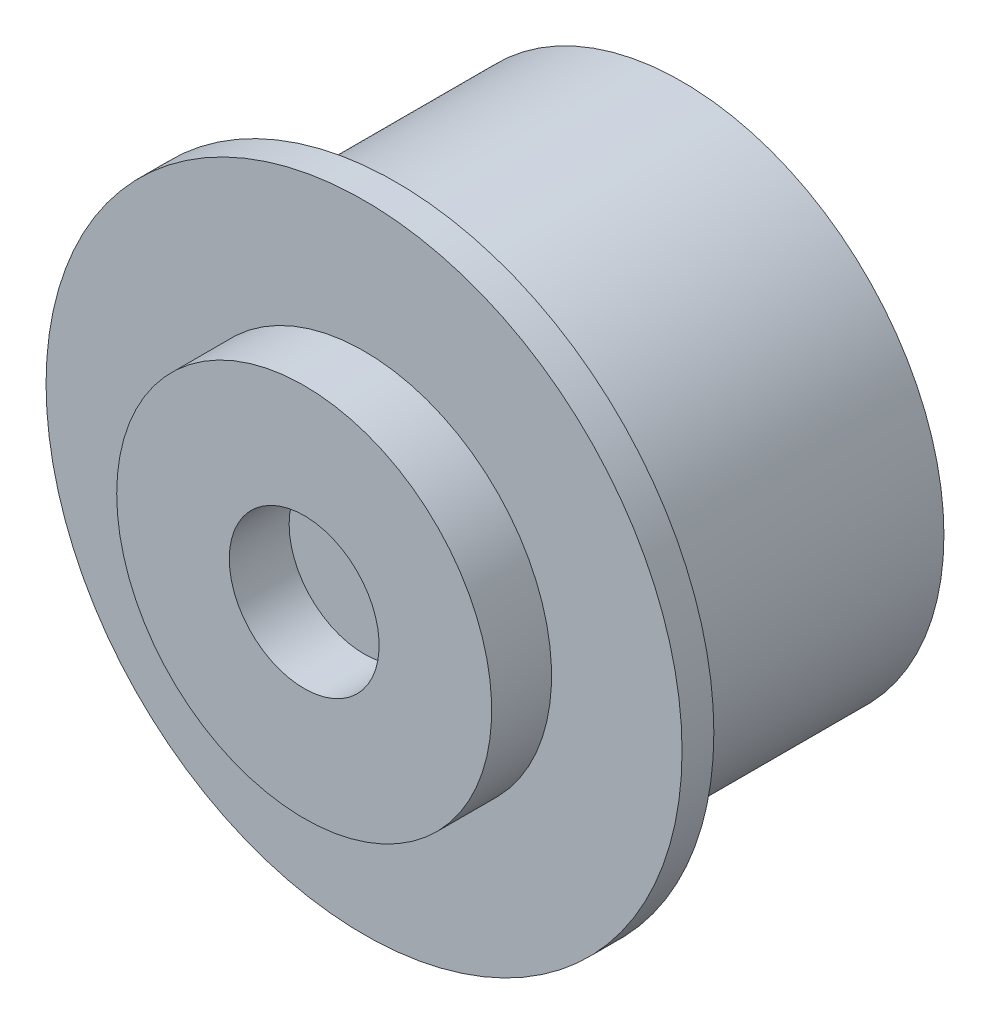
ISO-10303-21;
HEADER;
FILE_DESCRIPTION(('STEP AP214'),'2;1');
FILE_NAME('part.step','',(''),(''),'','','');
FILE_SCHEMA(('AUTOMOTIVE_DESIGN { 1 0 10303 214 1 1 1 1 }'));
ENDSEC;
DATA;
#1=APPLICATION_CONTEXT('core data for automotive mechanical design processes');
#2=APPLICATION_PROTOCOL_DEFINITION('international standard','automotive_design',2000,#1);
#3=PRODUCT_CONTEXT('',#1,'mechanical');
#4=PRODUCT('Part','Part','',(#3));
#5=PRODUCT_RELATED_PRODUCT_CATEGORY('part','',(#4));
#6=PRODUCT_DEFINITION_FORMATION('','',#4);
#7=PRODUCT_DEFINITION_CONTEXT('part definition',#1,'design');
#8=PRODUCT_DEFINITION('design','',#6,#7);
#9=PRODUCT_DEFINITION_SHAPE('','',#8);
#10=(LENGTH_UNIT() NAMED_UNIT(*) SI_UNIT(.MILLI.,.METRE.));
#11=(NAMED_UNIT(*) PLANE_ANGLE_UNIT() SI_UNIT($,.RADIAN.));
#12=(NAMED_UNIT(*) SI_UNIT($,.STERADIAN.) SOLID_ANGLE_UNIT());
#13=UNCERTAINTY_MEASURE_WITH_UNIT(LENGTH_MEASURE(1.E-05),#10,'distance_accuracy_value','');
#14=(GEOMETRIC_REPRESENTATION_CONTEXT(3) GLOBAL_UNCERTAINTY_ASSIGNED_CONTEXT((#13)) GLOBAL_UNIT_ASSIGNED_CONTEXT((#10,
#11,#12)) REPRESENTATION_CONTEXT('',''));
#15=CARTESIAN_POINT('',(0.,0.,0.));
#16=DIRECTION('',(0.,0.,1.));
#17=DIRECTION('',(1.,0.,0.));
#18=AXIS2_PLACEMENT_3D('',#15,#16,#17);
#19=CARTESIAN_POINT('',(0.,0.,0.));
#20=DIRECTION('',(0.,0.,-1.));
#21=DIRECTION('',(-1.,0.,0.));
#22=AXIS2_PLACEMENT_3D('',#19,#20,#21);
#23=PLANE('',#22);
#24=CARTESIAN_POINT('',(0.,0.,0.));
#25=DIRECTION('',(0.,0.,-1.));
#26=DIRECTION('',(-1.,0.,0.));
#27=AXIS2_PLACEMENT_3D('',#24,#25,#26);
#28=CIRCLE('',#27,2.003);
#29=CARTESIAN_POINT('',(-2.003,0.,0.));
#30=VERTEX_POINT('',#29);
#31=EDGE_CURVE('E40',#30,#30,#28,.F.);
#32=ORIENTED_EDGE('',*,*,#31,.T.);
#33=EDGE_LOOP('',(#32));
#34=FACE_BOUND('',#33,.T.);
#35=ADVANCED_FACE('F37',(#34),#23,.F.);
#36=CARTESIAN_POINT('',(0.,0.,2.105));
#37=DIRECTION('',(0.,0.,-1.));
#38=DIRECTION('',(-1.,0.,0.));
#39=AXIS2_PLACEMENT_3D('',#36,#37,#38);
#40=CYLINDRICAL_SURFACE('',#39,2.003);
#41=CARTESIAN_POINT('',(0.,0.,1.6));
#42=DIRECTION('',(0.,0.,-1.));
#43=DIRECTION('',(-1.,0.,0.));
#44=AXIS2_PLACEMENT_3D('',#41,#42,#43);
#45=CIRCLE('',#44,2.003);
#46=CARTESIAN_POINT('',(-2.003,0.,1.6));
#47=VERTEX_POINT('',#46);
#48=EDGE_CURVE('E80',#47,#47,#45,.F.);
#49=ORIENTED_EDGE('',*,*,#48,.T.);
#50=EDGE_LOOP('',(#49));
#51=FACE_BOUND('',#50,.T.);
#52=ORIENTED_EDGE('',*,*,#31,.F.);
#53=EDGE_LOOP('',(#52));
#54=FACE_BOUND('',#53,.T.);
#55=ADVANCED_FACE('F93',(#51,#54),#40,.F.);
#56=CARTESIAN_POINT('',(0.,0.,1.6));
#57=DIRECTION('',(0.,0.,-1.));
#58=DIRECTION('',(-1.,0.,0.));
#59=AXIS2_PLACEMENT_3D('',#56,#57,#58);
#60=PLANE('',#59);
#61=ORIENTED_EDGE('',*,*,#48,.F.);
#62=EDGE_LOOP('',(#61));
#63=FACE_BOUND('',#62,.T.);
#64=CARTESIAN_POINT('',(0.,0.,1.6));
#65=DIRECTION('',(0.,0.,-1.));
#66=DIRECTION('',(-1.,0.,0.));
#67=AXIS2_PLACEMENT_3D('',#64,#65,#66);
#68=CIRCLE('',#67,5.01175);
#69=CARTESIAN_POINT('',(-5.01175,0.,1.6));
#70=VERTEX_POINT('',#69);
#71=EDGE_CURVE('E76',#70,#70,#68,.T.);
#72=ORIENTED_EDGE('',*,*,#71,.F.);
#73=EDGE_LOOP('',(#72));
#74=FACE_BOUND('',#73,.T.);
#75=ADVANCED_FACE('F95',(#63,#74),#60,.F.);
#76=CARTESIAN_POINT('',(0.,0.,2.105));
#77=DIRECTION('',(0.,0.,-1.));
#78=DIRECTION('',(-1.,0.,0.));
#79=AXIS2_PLACEMENT_3D('',#76,#77,#78);
#80=CYLINDRICAL_SURFACE('',#79,5.01175);
#81=ORIENTED_EDGE('',*,*,#71,.T.);
#82=EDGE_LOOP('',(#81));
#83=FACE_BOUND('',#82,.T.);
#84=CARTESIAN_POINT('',(0.,0.,0.));
#85=DIRECTION('',(0.,0.,-1.));
#86=DIRECTION('',(-1.,0.,0.));
#87=AXIS2_PLACEMENT_3D('',#84,#85,#86);
#88=CIRCLE('',#87,5.01175);
#89=CARTESIAN_POINT('',(-5.01175,0.,0.));
#90=VERTEX_POINT('',#89);
#91=EDGE_CURVE('E72',#90,#90,#88,.F.);
#92=ORIENTED_EDGE('',*,*,#91,.T.);
#93=EDGE_LOOP('',(#92));
#94=FACE_BOUND('',#93,.T.);
#95=ADVANCED_FACE('F100',(#83,#94),#80,.T.);
#96=CARTESIAN_POINT('',(0.,0.,0.));
#97=DIRECTION('',(0.,0.,-1.));
#98=DIRECTION('',(-1.,0.,0.));
#99=AXIS2_PLACEMENT_3D('',#96,#97,#98);
#100=PLANE('',#99);
#101=ORIENTED_EDGE('',*,*,#91,.F.);
#102=EDGE_LOOP('',(#101));
#103=FACE_BOUND('',#102,.T.);
#104=CARTESIAN_POINT('',(0.,0.,0.));
#105=DIRECTION('',(0.,0.,-1.));
#106=DIRECTION('',(-1.,0.,0.));
#107=AXIS2_PLACEMENT_3D('',#104,#105,#106);
#108=CIRCLE('',#107,8.5);
#109=CARTESIAN_POINT('',(-8.5,0.,0.));
#110=VERTEX_POINT('',#109);
#111=EDGE_CURVE('E66',#110,#110,#108,.T.);
#112=ORIENTED_EDGE('',*,*,#111,.F.);
#113=EDGE_LOOP('',(#112));
#114=FACE_BOUND('',#113,.T.);
#115=ADVANCED_FACE('F129',(#103,#114),#100,.F.);
#116=CARTESIAN_POINT('',(0.,0.,-0.85));
#117=DIRECTION('',(0.,0.,-1.));
#118=DIRECTION('',(-1.,0.,0.));
#119=AXIS2_PLACEMENT_3D('',#116,#117,#118);
#120=PLANE('',#119);
#121=CARTESIAN_POINT('',(0.,0.,-0.85));
#122=DIRECTION('',(0.,0.,-1.));
#123=DIRECTION('',(-1.,0.,0.));
#124=AXIS2_PLACEMENT_3D('',#121,#122,#123);
#125=CIRCLE('',#124,2.003);
#126=CARTESIAN_POINT('',(-2.003,0.,-0.85));
#127=VERTEX_POINT('',#126);
#128=EDGE_CURVE('E61',#127,#127,#125,.T.);
#129=ORIENTED_EDGE('',*,*,#128,.T.);
#130=EDGE_LOOP('',(#129));
#131=FACE_BOUND('',#130,.T.);
#132=ADVANCED_FACE('F125',(#131),#120,.T.);
#133=CARTESIAN_POINT('',(0.,0.,0.0425));
#134=DIRECTION('',(0.,0.,-1.));
#135=DIRECTION('',(-1.,0.,0.));
#136=AXIS2_PLACEMENT_3D('',#133,#134,#135);
#137=CYLINDRICAL_SURFACE('',#136,8.5);
#138=ORIENTED_EDGE('',*,*,#111,.T.);
#139=EDGE_LOOP('',(#138));
#140=FACE_BOUND('',#139,.T.);
#141=CARTESIAN_POINT('',(0.,0.,-0.85));
#142=DIRECTION('',(0.,0.,-1.));
#143=DIRECTION('',(-1.,0.,0.));
#144=AXIS2_PLACEMENT_3D('',#141,#142,#143);
#145=CIRCLE('',#144,8.5);
#146=CARTESIAN_POINT('',(-8.5,0.,-0.85));
#147=VERTEX_POINT('',#146);
#148=EDGE_CURVE('E65',#147,#147,#145,.T.);
#149=ORIENTED_EDGE('',*,*,#148,.F.);
#150=EDGE_LOOP('',(#149));
#151=FACE_BOUND('',#150,.T.);
#152=ADVANCED_FACE('F121',(#140,#151),#137,.T.);
#153=CARTESIAN_POINT('',(0.,0.,2.105));
#154=DIRECTION('',(0.,0.,-1.));
#155=DIRECTION('',(-1.,0.,0.));
#156=AXIS2_PLACEMENT_3D('',#153,#154,#155);
#157=CYLINDRICAL_SURFACE('',#156,2.003);
#158=CARTESIAN_POINT('',(0.,0.,-8.5));
#159=DIRECTION('',(0.,0.,-1.));
#160=DIRECTION('',(-1.,0.,0.));
#161=AXIS2_PLACEMENT_3D('',#158,#159,#160);
#162=CIRCLE('',#161,2.003);
#163=CARTESIAN_POINT('',(-2.003,0.,-8.5));
#164=VERTEX_POINT('',#163);
#165=EDGE_CURVE('E52',#164,#164,#162,.F.);
#166=ORIENTED_EDGE('',*,*,#165,.F.);
#167=EDGE_LOOP('',(#166));
#168=FACE_BOUND('',#167,.T.);
#169=ORIENTED_EDGE('',*,*,#128,.F.);
#170=EDGE_LOOP('',(#169));
#171=FACE_BOUND('',#170,.T.);
#172=ADVANCED_FACE('F117',(#168,#171),#157,.F.);
#173=CARTESIAN_POINT('',(0.,0.,-0.85));
#174=DIRECTION('',(0.,0.,-1.));
#175=DIRECTION('',(-1.,0.,0.));
#176=AXIS2_PLACEMENT_3D('',#173,#174,#175);
#177=PLANE('',#176);
#178=CARTESIAN_POINT('',(0.,0.,-0.85));
#179=DIRECTION('',(0.,0.,-1.));
#180=DIRECTION('',(-1.,0.,0.));
#181=AXIS2_PLACEMENT_3D('',#178,#179,#180);
#182=CIRCLE('',#181,7.);
#183=CARTESIAN_POINT('',(-7.,0.,-0.85));
#184=VERTEX_POINT('',#183);
#185=EDGE_CURVE('E45',#184,#184,#182,.T.);
#186=ORIENTED_EDGE('',*,*,#185,.F.);
#187=EDGE_LOOP('',(#186));
#188=FACE_BOUND('',#187,.T.);
#189=ORIENTED_EDGE('',*,*,#148,.T.);
#190=EDGE_LOOP('',(#189));
#191=FACE_BOUND('',#190,.T.);
#192=ADVANCED_FACE('F110',(#188,#191),#177,.T.);
#193=CARTESIAN_POINT('',(0.,0.,-8.5));
#194=DIRECTION('',(0.,0.,-1.));
#195=DIRECTION('',(-1.,0.,0.));
#196=AXIS2_PLACEMENT_3D('',#193,#194,#195);
#197=PLANE('',#196);
#198=ORIENTED_EDGE('',*,*,#165,.T.);
#199=EDGE_LOOP('',(#198));
#200=FACE_BOUND('',#199,.T.);
#201=CARTESIAN_POINT('',(0.,0.,-8.5));
#202=DIRECTION('',(0.,0.,-1.));
#203=DIRECTION('',(-1.,0.,0.));
#204=AXIS2_PLACEMENT_3D('',#201,#202,#203);
#205=CIRCLE('',#204,7.);
#206=CARTESIAN_POINT('',(-7.,0.,-8.5));
#207=VERTEX_POINT('',#206);
#208=EDGE_CURVE('E11',#207,#207,#205,.F.);
#209=ORIENTED_EDGE('',*,*,#208,.F.);
#210=EDGE_LOOP('',(#209));
#211=FACE_BOUND('',#210,.T.);
#212=ADVANCED_FACE('F105',(#200,#211),#197,.T.);
#213=CARTESIAN_POINT('',(0.,0.,2.105));
#214=DIRECTION('',(0.,0.,-1.));
#215=DIRECTION('',(-1.,0.,0.));
#216=AXIS2_PLACEMENT_3D('',#213,#214,#215);
#217=CYLINDRICAL_SURFACE('',#216,7.);
#218=ORIENTED_EDGE('',*,*,#208,.T.);
#219=EDGE_LOOP('',(#218));
#220=FACE_BOUND('',#219,.T.);
#221=ORIENTED_EDGE('',*,*,#185,.T.);
#222=EDGE_LOOP('',(#221));
#223=FACE_BOUND('',#222,.T.);
#224=ADVANCED_FACE('F103',(#220,#223),#217,.T.);
#225=CLOSED_SHELL('',(#35,#55,#75,#95,#115,#132,#152,#172,#192,#212,#224));
#226=MANIFOLD_SOLID_BREP('B2',#225);
#227=ADVANCED_BREP_SHAPE_REPRESENTATION('',(#18,#226),#14);
#228=SHAPE_DEFINITION_REPRESENTATION(#9,#227);
ENDSEC;
END-ISO-10303-21;
